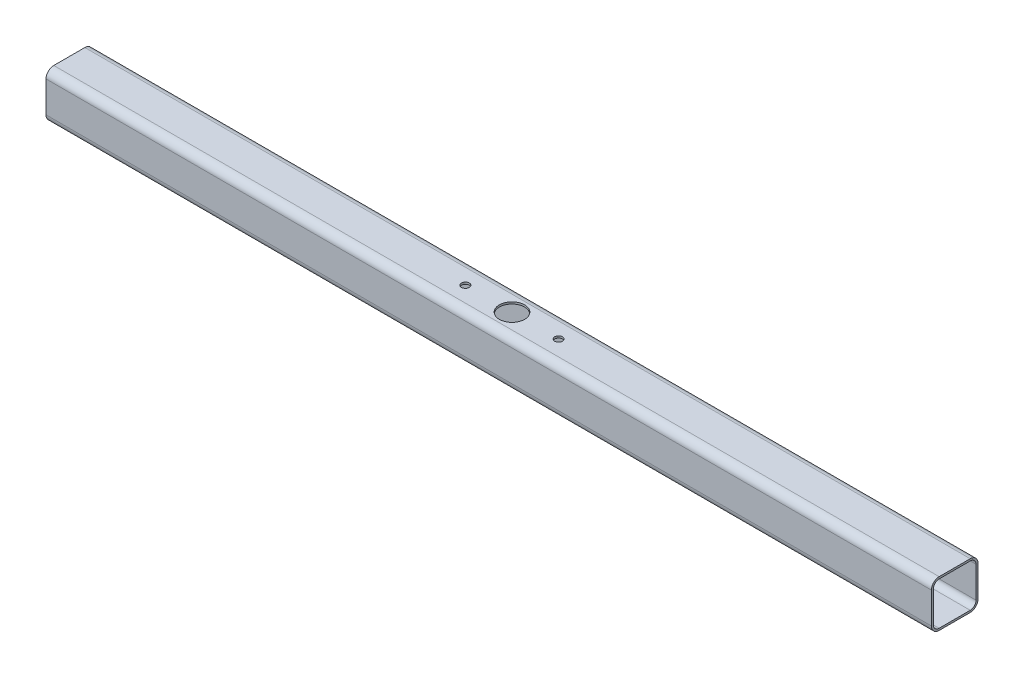
ISO-10303-21;
HEADER;
FILE_DESCRIPTION(('STEP AP214'),'2;1');
FILE_NAME('part.step','',(''),(''),'','','');
FILE_SCHEMA(('AUTOMOTIVE_DESIGN { 1 0 10303 214 1 1 1 1 }'));
ENDSEC;
DATA;
#1=APPLICATION_CONTEXT('core data for automotive mechanical design processes');
#2=APPLICATION_PROTOCOL_DEFINITION('international standard','automotive_design',2000,#1);
#3=PRODUCT_CONTEXT('',#1,'mechanical');
#4=PRODUCT('Part','Part','',(#3));
#5=PRODUCT_RELATED_PRODUCT_CATEGORY('part','',(#4));
#6=PRODUCT_DEFINITION_FORMATION('','',#4);
#7=PRODUCT_DEFINITION_CONTEXT('part definition',#1,'design');
#8=PRODUCT_DEFINITION('design','',#6,#7);
#9=PRODUCT_DEFINITION_SHAPE('','',#8);
#10=(LENGTH_UNIT() NAMED_UNIT(*) SI_UNIT(.MILLI.,.METRE.));
#11=(NAMED_UNIT(*) PLANE_ANGLE_UNIT() SI_UNIT($,.RADIAN.));
#12=(NAMED_UNIT(*) SI_UNIT($,.STERADIAN.) SOLID_ANGLE_UNIT());
#13=UNCERTAINTY_MEASURE_WITH_UNIT(LENGTH_MEASURE(1.E-05),#10,'distance_accuracy_value','');
#14=(GEOMETRIC_REPRESENTATION_CONTEXT(3) GLOBAL_UNCERTAINTY_ASSIGNED_CONTEXT((#13)) GLOBAL_UNIT_ASSIGNED_CONTEXT((#10,
#11,#12)) REPRESENTATION_CONTEXT('',''));
#15=CARTESIAN_POINT('',(0.,0.,0.));
#16=DIRECTION('',(0.,0.,1.));
#17=DIRECTION('',(1.,0.,0.));
#18=AXIS2_PLACEMENT_3D('',#15,#16,#17);
#19=CARTESIAN_POINT('',(-1447.8,-25.4000000000002,25.4));
#20=DIRECTION('',(1.,0.,0.));
#21=DIRECTION('',(0.,1.,0.));
#22=AXIS2_PLACEMENT_3D('',#19,#20,#21);
#23=CYLINDRICAL_SURFACE('',#22,12.7);
#24=CARTESIAN_POINT('',(0.,-25.4,25.4));
#25=DIRECTION('',(-1.,0.,0.));
#26=DIRECTION('',(0.,-1.,0.));
#27=AXIS2_PLACEMENT_3D('',#24,#25,#26);
#28=CIRCLE('',#27,12.7);
#29=CARTESIAN_POINT('',(0.,-38.1,25.4));
#30=VERTEX_POINT('',#29);
#31=CARTESIAN_POINT('',(0.,-25.4,38.1));
#32=VERTEX_POINT('',#31);
#33=EDGE_CURVE('E236',#30,#32,#28,.T.);
#34=ORIENTED_EDGE('',*,*,#33,.T.);
#35=DIRECTION('',(1.,0.,0.));
#36=VECTOR('',#35,1.);
#37=CARTESIAN_POINT('',(-1447.8,-25.4000000000002,38.1));
#38=LINE('',#37,#36);
#39=CARTESIAN_POINT('',(-1447.8,-25.4000000000002,38.1));
#40=VERTEX_POINT('',#39);
#41=EDGE_CURVE('E12',#40,#32,#38,.T.);
#42=ORIENTED_EDGE('',*,*,#41,.F.);
#43=CARTESIAN_POINT('',(-1447.8,-25.4000000000002,25.4));
#44=DIRECTION('',(-1.,0.,0.));
#45=DIRECTION('',(0.,-1.,0.));
#46=AXIS2_PLACEMENT_3D('',#43,#44,#45);
#47=CIRCLE('',#46,12.7);
#48=CARTESIAN_POINT('',(-1447.8,-38.1000000000002,25.4));
#49=VERTEX_POINT('',#48);
#50=EDGE_CURVE('E315',#49,#40,#47,.T.);
#51=ORIENTED_EDGE('',*,*,#50,.F.);
#52=DIRECTION('',(1.,0.,0.));
#53=VECTOR('',#52,1.);
#54=CARTESIAN_POINT('',(-1447.8,-38.1000000000002,25.4));
#55=LINE('',#54,#53);
#56=EDGE_CURVE('E251',#49,#30,#55,.T.);
#57=ORIENTED_EDGE('',*,*,#56,.T.);
#58=EDGE_LOOP('',(#34,#42,#51,#57));
#59=FACE_BOUND('',#58,.T.);
#60=ADVANCED_FACE('F62',(#59),#23,.T.);
#61=CARTESIAN_POINT('',(-1447.8,-25.4000000000002,38.1));
#62=DIRECTION('',(0.,0.,-1.));
#63=DIRECTION('',(-1.,0.,0.));
#64=AXIS2_PLACEMENT_3D('',#61,#62,#63);
#65=PLANE('',#64);
#66=DIRECTION('',(0.,1.,0.));
#67=VECTOR('',#66,1.);
#68=CARTESIAN_POINT('',(0.,-25.4,38.1));
#69=LINE('',#68,#67);
#70=CARTESIAN_POINT('',(0.,25.4,38.1));
#71=VERTEX_POINT('',#70);
#72=EDGE_CURVE('E239',#32,#71,#69,.T.);
#73=ORIENTED_EDGE('',*,*,#72,.T.);
#74=DIRECTION('',(1.,0.,0.));
#75=VECTOR('',#74,1.);
#76=CARTESIAN_POINT('',(-1447.8,25.3999999999998,38.1));
#77=LINE('',#76,#75);
#78=CARTESIAN_POINT('',(-1447.8,25.3999999999998,38.1));
#79=VERTEX_POINT('',#78);
#80=EDGE_CURVE('E72',#79,#71,#77,.T.);
#81=ORIENTED_EDGE('',*,*,#80,.F.);
#82=DIRECTION('',(0.,1.,0.));
#83=VECTOR('',#82,1.);
#84=CARTESIAN_POINT('',(-1447.8,-25.4000000000002,38.1));
#85=LINE('',#84,#83);
#86=EDGE_CURVE('E317',#40,#79,#85,.T.);
#87=ORIENTED_EDGE('',*,*,#86,.F.);
#88=ORIENTED_EDGE('',*,*,#41,.T.);
#89=EDGE_LOOP('',(#73,#81,#87,#88));
#90=FACE_BOUND('',#89,.T.);
#91=ADVANCED_FACE('F354',(#90),#65,.F.);
#92=CARTESIAN_POINT('',(-1447.8,25.3999999999998,25.4));
#93=DIRECTION('',(1.,0.,0.));
#94=DIRECTION('',(0.,1.,0.));
#95=AXIS2_PLACEMENT_3D('',#92,#93,#94);
#96=CYLINDRICAL_SURFACE('',#95,12.7);
#97=CARTESIAN_POINT('',(0.,25.4,25.4));
#98=DIRECTION('',(-1.,0.,0.));
#99=DIRECTION('',(0.,-1.,0.));
#100=AXIS2_PLACEMENT_3D('',#97,#98,#99);
#101=CIRCLE('',#100,12.7);
#102=CARTESIAN_POINT('',(0.,38.1,25.4));
#103=VERTEX_POINT('',#102);
#104=EDGE_CURVE('E241',#71,#103,#101,.T.);
#105=ORIENTED_EDGE('',*,*,#104,.T.);
#106=DIRECTION('',(1.,0.,0.));
#107=VECTOR('',#106,1.);
#108=CARTESIAN_POINT('',(-1447.8,38.0999999999998,25.4));
#109=LINE('',#108,#107);
#110=CARTESIAN_POINT('',(-1447.8,38.0999999999998,25.4));
#111=VERTEX_POINT('',#110);
#112=EDGE_CURVE('E258',#111,#103,#109,.T.);
#113=ORIENTED_EDGE('',*,*,#112,.F.);
#114=CARTESIAN_POINT('',(-1447.8,25.3999999999998,25.4));
#115=DIRECTION('',(-1.,0.,0.));
#116=DIRECTION('',(0.,-1.,0.));
#117=AXIS2_PLACEMENT_3D('',#114,#115,#116);
#118=CIRCLE('',#117,12.7);
#119=EDGE_CURVE('E319',#79,#111,#118,.T.);
#120=ORIENTED_EDGE('',*,*,#119,.F.);
#121=ORIENTED_EDGE('',*,*,#80,.T.);
#122=EDGE_LOOP('',(#105,#113,#120,#121));
#123=FACE_BOUND('',#122,.T.);
#124=ADVANCED_FACE('F359',(#123),#96,.T.);
#125=CARTESIAN_POINT('',(-1447.8,38.0999999999998,-25.4));
#126=DIRECTION('',(0.,-1.,0.));
#127=DIRECTION('',(1.,0.,0.));
#128=AXIS2_PLACEMENT_3D('',#125,#126,#127);
#129=PLANE('',#128);
#130=CARTESIAN_POINT('',(-800.1,38.0999999999999,0.));
#131=DIRECTION('',(0.,1.,0.));
#132=DIRECTION('',(0.,0.,1.));
#133=AXIS2_PLACEMENT_3D('',#130,#131,#132);
#134=CIRCLE('',#133,6.34999999999997);
#135=CARTESIAN_POINT('',(-800.1,38.0999999999999,6.34999999999997));
#136=VERTEX_POINT('',#135);
#137=EDGE_CURVE('E536',#136,#136,#134,.T.);
#138=ORIENTED_EDGE('',*,*,#137,.F.);
#139=EDGE_LOOP('',(#138));
#140=FACE_BOUND('',#139,.T.);
#141=CARTESIAN_POINT('',(-647.7,38.0999999999999,0.));
#142=DIRECTION('',(0.,1.,0.));
#143=DIRECTION('',(0.,0.,1.));
#144=AXIS2_PLACEMENT_3D('',#141,#142,#143);
#145=CIRCLE('',#144,6.34999999999997);
#146=CARTESIAN_POINT('',(-647.7,38.0999999999999,6.34999999999997));
#147=VERTEX_POINT('',#146);
#148=EDGE_CURVE('E538',#147,#147,#145,.T.);
#149=ORIENTED_EDGE('',*,*,#148,.F.);
#150=EDGE_LOOP('',(#149));
#151=FACE_BOUND('',#150,.T.);
#152=CARTESIAN_POINT('',(-723.9,38.0999999999999,0.));
#153=DIRECTION('',(0.,1.,0.));
#154=DIRECTION('',(-1.,0.,0.));
#155=AXIS2_PLACEMENT_3D('',#152,#153,#154);
#156=CIRCLE('',#155,20.6375);
#157=CARTESIAN_POINT('',(-744.5375,38.0999999999999,0.));
#158=VERTEX_POINT('',#157);
#159=EDGE_CURVE('E545',#158,#158,#156,.T.);
#160=ORIENTED_EDGE('',*,*,#159,.F.);
#161=EDGE_LOOP('',(#160));
#162=FACE_BOUND('',#161,.T.);
#163=DIRECTION('',(0.,0.,-1.));
#164=VECTOR('',#163,1.);
#165=CARTESIAN_POINT('',(0.,38.1,-25.4));
#166=LINE('',#165,#164);
#167=CARTESIAN_POINT('',(0.,38.1,-25.4));
#168=VERTEX_POINT('',#167);
#169=EDGE_CURVE('E243',#103,#168,#166,.T.);
#170=ORIENTED_EDGE('',*,*,#169,.T.);
#171=DIRECTION('',(1.,0.,0.));
#172=VECTOR('',#171,1.);
#173=CARTESIAN_POINT('',(-1447.8,38.0999999999998,-25.4));
#174=LINE('',#173,#172);
#175=CARTESIAN_POINT('',(-1447.8,38.0999999999998,-25.4));
#176=VERTEX_POINT('',#175);
#177=EDGE_CURVE('E255',#176,#168,#174,.T.);
#178=ORIENTED_EDGE('',*,*,#177,.F.);
#179=DIRECTION('',(0.,0.,-1.));
#180=VECTOR('',#179,1.);
#181=CARTESIAN_POINT('',(-1447.8,38.0999999999998,-25.4));
#182=LINE('',#181,#180);
#183=EDGE_CURVE('E321',#111,#176,#182,.T.);
#184=ORIENTED_EDGE('',*,*,#183,.F.);
#185=ORIENTED_EDGE('',*,*,#112,.T.);
#186=EDGE_LOOP('',(#170,#178,#184,#185));
#187=FACE_BOUND('',#186,.T.);
#188=ADVANCED_FACE('F327',(#140,#151,#162,#187),#129,.F.);
#189=CARTESIAN_POINT('',(-1447.8,25.3999999999998,-25.4));
#190=DIRECTION('',(1.,0.,0.));
#191=DIRECTION('',(0.,1.,0.));
#192=AXIS2_PLACEMENT_3D('',#189,#190,#191);
#193=CYLINDRICAL_SURFACE('',#192,12.7);
#194=CARTESIAN_POINT('',(0.,25.4,-25.4));
#195=DIRECTION('',(-1.,0.,0.));
#196=DIRECTION('',(0.,-1.,0.));
#197=AXIS2_PLACEMENT_3D('',#194,#195,#196);
#198=CIRCLE('',#197,12.7);
#199=CARTESIAN_POINT('',(0.,25.4,-38.1));
#200=VERTEX_POINT('',#199);
#201=EDGE_CURVE('E245',#168,#200,#198,.T.);
#202=ORIENTED_EDGE('',*,*,#201,.T.);
#203=DIRECTION('',(1.,0.,0.));
#204=VECTOR('',#203,1.);
#205=CARTESIAN_POINT('',(-1447.8,25.3999999999998,-38.1));
#206=LINE('',#205,#204);
#207=CARTESIAN_POINT('',(-1447.8,25.3999999999998,-38.1));
#208=VERTEX_POINT('',#207);
#209=EDGE_CURVE('E202',#208,#200,#206,.T.);
#210=ORIENTED_EDGE('',*,*,#209,.F.);
#211=CARTESIAN_POINT('',(-1447.8,25.3999999999998,-25.4));
#212=DIRECTION('',(-1.,0.,0.));
#213=DIRECTION('',(0.,-1.,0.));
#214=AXIS2_PLACEMENT_3D('',#211,#212,#213);
#215=CIRCLE('',#214,12.7);
#216=EDGE_CURVE('E193',#176,#208,#215,.T.);
#217=ORIENTED_EDGE('',*,*,#216,.F.);
#218=ORIENTED_EDGE('',*,*,#177,.T.);
#219=EDGE_LOOP('',(#202,#210,#217,#218));
#220=FACE_BOUND('',#219,.T.);
#221=ADVANCED_FACE('F331',(#220),#193,.T.);
#222=CARTESIAN_POINT('',(-1447.8,25.3999999999998,-38.1));
#223=DIRECTION('',(0.,0.,1.));
#224=DIRECTION('',(1.,0.,0.));
#225=AXIS2_PLACEMENT_3D('',#222,#223,#224);
#226=PLANE('',#225);
#227=DIRECTION('',(0.,-1.,0.));
#228=VECTOR('',#227,1.);
#229=CARTESIAN_POINT('',(0.,25.4,-38.1));
#230=LINE('',#229,#228);
#231=CARTESIAN_POINT('',(0.,-25.4,-38.1));
#232=VERTEX_POINT('',#231);
#233=EDGE_CURVE('E201',#200,#232,#230,.T.);
#234=ORIENTED_EDGE('',*,*,#233,.T.);
#235=DIRECTION('',(1.,0.,0.));
#236=VECTOR('',#235,1.);
#237=CARTESIAN_POINT('',(-1447.8,-25.4000000000002,-38.1));
#238=LINE('',#237,#236);
#239=CARTESIAN_POINT('',(-1447.8,-25.4000000000002,-38.1));
#240=VERTEX_POINT('',#239);
#241=EDGE_CURVE('E198',#240,#232,#238,.T.);
#242=ORIENTED_EDGE('',*,*,#241,.F.);
#243=DIRECTION('',(0.,-1.,0.));
#244=VECTOR('',#243,1.);
#245=CARTESIAN_POINT('',(-1447.8,25.3999999999998,-38.1));
#246=LINE('',#245,#244);
#247=EDGE_CURVE('E187',#208,#240,#246,.T.);
#248=ORIENTED_EDGE('',*,*,#247,.F.);
#249=ORIENTED_EDGE('',*,*,#209,.T.);
#250=EDGE_LOOP('',(#234,#242,#248,#249));
#251=FACE_BOUND('',#250,.T.);
#252=ADVANCED_FACE('F199',(#251),#226,.F.);
#253=CARTESIAN_POINT('',(-1447.8,-25.4000000000002,-25.4));
#254=DIRECTION('',(1.,0.,0.));
#255=DIRECTION('',(0.,1.,0.));
#256=AXIS2_PLACEMENT_3D('',#253,#254,#255);
#257=CYLINDRICAL_SURFACE('',#256,12.7);
#258=CARTESIAN_POINT('',(0.,-25.4,-25.4));
#259=DIRECTION('',(-1.,0.,0.));
#260=DIRECTION('',(0.,-1.,0.));
#261=AXIS2_PLACEMENT_3D('',#258,#259,#260);
#262=CIRCLE('',#261,12.7);
#263=CARTESIAN_POINT('',(0.,-38.1,-25.4));
#264=VERTEX_POINT('',#263);
#265=EDGE_CURVE('E134',#232,#264,#262,.T.);
#266=ORIENTED_EDGE('',*,*,#265,.T.);
#267=DIRECTION('',(1.,0.,0.));
#268=VECTOR('',#267,1.);
#269=CARTESIAN_POINT('',(-1447.8,-38.1000000000002,-25.4));
#270=LINE('',#269,#268);
#271=CARTESIAN_POINT('',(-1447.8,-38.1000000000002,-25.4));
#272=VERTEX_POINT('',#271);
#273=EDGE_CURVE('E203',#272,#264,#270,.T.);
#274=ORIENTED_EDGE('',*,*,#273,.F.);
#275=CARTESIAN_POINT('',(-1447.8,-25.4000000000002,-25.4));
#276=DIRECTION('',(-1.,0.,0.));
#277=DIRECTION('',(0.,-1.,0.));
#278=AXIS2_PLACEMENT_3D('',#275,#276,#277);
#279=CIRCLE('',#278,12.7);
#280=EDGE_CURVE('E191',#240,#272,#279,.T.);
#281=ORIENTED_EDGE('',*,*,#280,.F.);
#282=ORIENTED_EDGE('',*,*,#241,.T.);
#283=EDGE_LOOP('',(#266,#274,#281,#282));
#284=FACE_BOUND('',#283,.T.);
#285=ADVANCED_FACE('F205',(#284),#257,.T.);
#286=CARTESIAN_POINT('',(-1447.8,25.3999999999998,25.4));
#287=DIRECTION('',(1.,0.,0.));
#288=DIRECTION('',(0.,1.,0.));
#289=AXIS2_PLACEMENT_3D('',#286,#287,#288);
#290=CYLINDRICAL_SURFACE('',#289,9.52499999999999);
#291=CARTESIAN_POINT('',(0.,25.4,25.4));
#292=DIRECTION('',(-1.,0.,0.));
#293=DIRECTION('',(0.,-1.,0.));
#294=AXIS2_PLACEMENT_3D('',#291,#292,#293);
#295=CIRCLE('',#294,9.52499999999999);
#296=CARTESIAN_POINT('',(0.,25.4,34.925));
#297=VERTEX_POINT('',#296);
#298=CARTESIAN_POINT('',(0.,34.925,25.4));
#299=VERTEX_POINT('',#298);
#300=EDGE_CURVE('E211',#297,#299,#295,.T.);
#301=ORIENTED_EDGE('',*,*,#300,.F.);
#302=DIRECTION('',(1.,0.,0.));
#303=VECTOR('',#302,1.);
#304=CARTESIAN_POINT('',(-1447.8,25.3999999999998,34.925));
#305=LINE('',#304,#303);
#306=CARTESIAN_POINT('',(-1447.8,25.3999999999998,34.925));
#307=VERTEX_POINT('',#306);
#308=EDGE_CURVE('E148',#307,#297,#305,.T.);
#309=ORIENTED_EDGE('',*,*,#308,.F.);
#310=CARTESIAN_POINT('',(-1447.8,25.3999999999998,25.4));
#311=DIRECTION('',(-1.,0.,0.));
#312=DIRECTION('',(0.,-1.,0.));
#313=AXIS2_PLACEMENT_3D('',#310,#311,#312);
#314=CIRCLE('',#313,9.52499999999999);
#315=CARTESIAN_POINT('',(-1447.8,34.9249999999998,25.4));
#316=VERTEX_POINT('',#315);
#317=EDGE_CURVE('E250',#307,#316,#314,.T.);
#318=ORIENTED_EDGE('',*,*,#317,.T.);
#319=DIRECTION('',(1.,0.,0.));
#320=VECTOR('',#319,1.);
#321=CARTESIAN_POINT('',(-1447.8,34.9249999999998,25.4));
#322=LINE('',#321,#320);
#323=EDGE_CURVE('E207',#316,#299,#322,.T.);
#324=ORIENTED_EDGE('',*,*,#323,.T.);
#325=EDGE_LOOP('',(#301,#309,#318,#324));
#326=FACE_BOUND('',#325,.T.);
#327=ADVANCED_FACE('F64',(#326),#290,.F.);
#328=CARTESIAN_POINT('',(-1447.8,-25.4000000000002,34.925));
#329=DIRECTION('',(0.,0.,-1.));
#330=DIRECTION('',(-1.,0.,0.));
#331=AXIS2_PLACEMENT_3D('',#328,#329,#330);
#332=PLANE('',#331);
#333=DIRECTION('',(0.,1.,0.));
#334=VECTOR('',#333,1.);
#335=CARTESIAN_POINT('',(0.,-25.4,34.925));
#336=LINE('',#335,#334);
#337=CARTESIAN_POINT('',(0.,-25.4,34.925));
#338=VERTEX_POINT('',#337);
#339=EDGE_CURVE('E214',#338,#297,#336,.T.);
#340=ORIENTED_EDGE('',*,*,#339,.F.);
#341=DIRECTION('',(1.,0.,0.));
#342=VECTOR('',#341,1.);
#343=CARTESIAN_POINT('',(-1447.8,-25.4000000000002,34.925));
#344=LINE('',#343,#342);
#345=CARTESIAN_POINT('',(-1447.8,-25.4000000000002,34.925));
#346=VERTEX_POINT('',#345);
#347=EDGE_CURVE('E274',#346,#338,#344,.T.);
#348=ORIENTED_EDGE('',*,*,#347,.F.);
#349=DIRECTION('',(0.,1.,0.));
#350=VECTOR('',#349,1.);
#351=CARTESIAN_POINT('',(-1447.8,-25.4000000000002,34.925));
#352=LINE('',#351,#350);
#353=EDGE_CURVE('E280',#346,#307,#352,.T.);
#354=ORIENTED_EDGE('',*,*,#353,.T.);
#355=ORIENTED_EDGE('',*,*,#308,.T.);
#356=EDGE_LOOP('',(#340,#348,#354,#355));
#357=FACE_BOUND('',#356,.T.);
#358=ADVANCED_FACE('F278',(#357),#332,.T.);
#359=CARTESIAN_POINT('',(-1447.8,-25.4000000000002,25.4));
#360=DIRECTION('',(1.,0.,0.));
#361=DIRECTION('',(0.,1.,0.));
#362=AXIS2_PLACEMENT_3D('',#359,#360,#361);
#363=CYLINDRICAL_SURFACE('',#362,9.52499999999999);
#364=CARTESIAN_POINT('',(0.,-25.4,25.4));
#365=DIRECTION('',(-1.,0.,0.));
#366=DIRECTION('',(0.,-1.,0.));
#367=AXIS2_PLACEMENT_3D('',#364,#365,#366);
#368=CIRCLE('',#367,9.52499999999999);
#369=CARTESIAN_POINT('',(0.,-34.925,25.4));
#370=VERTEX_POINT('',#369);
#371=EDGE_CURVE('E218',#370,#338,#368,.T.);
#372=ORIENTED_EDGE('',*,*,#371,.F.);
#373=DIRECTION('',(1.,0.,0.));
#374=VECTOR('',#373,1.);
#375=CARTESIAN_POINT('',(-1447.8,-34.9250000000002,25.4));
#376=LINE('',#375,#374);
#377=CARTESIAN_POINT('',(-1447.8,-34.9250000000002,25.4));
#378=VERTEX_POINT('',#377);
#379=EDGE_CURVE('E272',#378,#370,#376,.T.);
#380=ORIENTED_EDGE('',*,*,#379,.F.);
#381=CARTESIAN_POINT('',(-1447.8,-25.4000000000002,25.4));
#382=DIRECTION('',(-1.,0.,0.));
#383=DIRECTION('',(0.,-1.,0.));
#384=AXIS2_PLACEMENT_3D('',#381,#382,#383);
#385=CIRCLE('',#384,9.52499999999999);
#386=EDGE_CURVE('E291',#378,#346,#385,.T.);
#387=ORIENTED_EDGE('',*,*,#386,.T.);
#388=ORIENTED_EDGE('',*,*,#347,.T.);
#389=EDGE_LOOP('',(#372,#380,#387,#388));
#390=FACE_BOUND('',#389,.T.);
#391=ADVANCED_FACE('F288',(#390),#363,.F.);
#392=CARTESIAN_POINT('',(-1447.8,-34.9250000000002,25.4));
#393=DIRECTION('',(0.,1.,0.));
#394=DIRECTION('',(-1.,0.,0.));
#395=AXIS2_PLACEMENT_3D('',#392,#393,#394);
#396=PLANE('',#395);
#397=CARTESIAN_POINT('',(-723.9,-34.9250000000001,0.));
#398=DIRECTION('',(0.,1.,0.));
#399=DIRECTION('',(-1.,0.,0.));
#400=AXIS2_PLACEMENT_3D('',#397,#398,#399);
#401=CIRCLE('',#400,20.6375);
#402=CARTESIAN_POINT('',(-744.5375,-34.9250000000001,0.));
#403=VERTEX_POINT('',#402);
#404=EDGE_CURVE('E215',#403,#403,#401,.T.);
#405=ORIENTED_EDGE('',*,*,#404,.F.);
#406=EDGE_LOOP('',(#405));
#407=FACE_BOUND('',#406,.T.);
#408=DIRECTION('',(0.,0.,1.));
#409=VECTOR('',#408,1.);
#410=CARTESIAN_POINT('',(0.,-34.925,25.4));
#411=LINE('',#410,#409);
#412=CARTESIAN_POINT('',(0.,-34.925,-25.4));
#413=VERTEX_POINT('',#412);
#414=EDGE_CURVE('E221',#413,#370,#411,.T.);
#415=ORIENTED_EDGE('',*,*,#414,.F.);
#416=DIRECTION('',(1.,0.,0.));
#417=VECTOR('',#416,1.);
#418=CARTESIAN_POINT('',(-1447.8,-34.9250000000002,-25.4));
#419=LINE('',#418,#417);
#420=CARTESIAN_POINT('',(-1447.8,-34.9250000000002,-25.4));
#421=VERTEX_POINT('',#420);
#422=EDGE_CURVE('E270',#421,#413,#419,.T.);
#423=ORIENTED_EDGE('',*,*,#422,.F.);
#424=DIRECTION('',(0.,0.,1.));
#425=VECTOR('',#424,1.);
#426=CARTESIAN_POINT('',(-1447.8,-34.9250000000002,25.4));
#427=LINE('',#426,#425);
#428=EDGE_CURVE('E297',#421,#378,#427,.T.);
#429=ORIENTED_EDGE('',*,*,#428,.T.);
#430=ORIENTED_EDGE('',*,*,#379,.T.);
#431=EDGE_LOOP('',(#415,#423,#429,#430));
#432=FACE_BOUND('',#431,.T.);
#433=ADVANCED_FACE('F374',(#407,#432),#396,.T.);
#434=CARTESIAN_POINT('',(-1447.8,-25.4000000000002,-25.4));
#435=DIRECTION('',(1.,0.,0.));
#436=DIRECTION('',(0.,1.,0.));
#437=AXIS2_PLACEMENT_3D('',#434,#435,#436);
#438=CYLINDRICAL_SURFACE('',#437,9.52499999999999);
#439=CARTESIAN_POINT('',(0.,-25.4,-25.4));
#440=DIRECTION('',(-1.,0.,0.));
#441=DIRECTION('',(0.,-1.,0.));
#442=AXIS2_PLACEMENT_3D('',#439,#440,#441);
#443=CIRCLE('',#442,9.52499999999999);
#444=CARTESIAN_POINT('',(0.,-25.4,-34.925));
#445=VERTEX_POINT('',#444);
#446=EDGE_CURVE('E224',#445,#413,#443,.T.);
#447=ORIENTED_EDGE('',*,*,#446,.F.);
#448=DIRECTION('',(1.,0.,0.));
#449=VECTOR('',#448,1.);
#450=CARTESIAN_POINT('',(-1447.8,-25.4000000000002,-34.925));
#451=LINE('',#450,#449);
#452=CARTESIAN_POINT('',(-1447.8,-25.4000000000002,-34.925));
#453=VERTEX_POINT('',#452);
#454=EDGE_CURVE('E268',#453,#445,#451,.T.);
#455=ORIENTED_EDGE('',*,*,#454,.F.);
#456=CARTESIAN_POINT('',(-1447.8,-25.4000000000002,-25.4));
#457=DIRECTION('',(-1.,0.,0.));
#458=DIRECTION('',(0.,-1.,0.));
#459=AXIS2_PLACEMENT_3D('',#456,#457,#458);
#460=CIRCLE('',#459,9.52499999999999);
#461=EDGE_CURVE('E303',#453,#421,#460,.T.);
#462=ORIENTED_EDGE('',*,*,#461,.T.);
#463=ORIENTED_EDGE('',*,*,#422,.T.);
#464=EDGE_LOOP('',(#447,#455,#462,#463));
#465=FACE_BOUND('',#464,.T.);
#466=ADVANCED_FACE('F370',(#465),#438,.F.);
#467=CARTESIAN_POINT('',(-1447.8,25.3999999999998,-34.925));
#468=DIRECTION('',(0.,0.,1.));
#469=DIRECTION('',(1.,0.,0.));
#470=AXIS2_PLACEMENT_3D('',#467,#468,#469);
#471=PLANE('',#470);
#472=DIRECTION('',(0.,-1.,0.));
#473=VECTOR('',#472,1.);
#474=CARTESIAN_POINT('',(0.,25.4,-34.925));
#475=LINE('',#474,#473);
#476=CARTESIAN_POINT('',(0.,25.4,-34.925));
#477=VERTEX_POINT('',#476);
#478=EDGE_CURVE('E227',#477,#445,#475,.T.);
#479=ORIENTED_EDGE('',*,*,#478,.F.);
#480=DIRECTION('',(1.,0.,0.));
#481=VECTOR('',#480,1.);
#482=CARTESIAN_POINT('',(-1447.8,25.3999999999998,-34.925));
#483=LINE('',#482,#481);
#484=CARTESIAN_POINT('',(-1447.8,25.3999999999998,-34.925));
#485=VERTEX_POINT('',#484);
#486=EDGE_CURVE('E266',#485,#477,#483,.T.);
#487=ORIENTED_EDGE('',*,*,#486,.F.);
#488=DIRECTION('',(0.,-1.,0.));
#489=VECTOR('',#488,1.);
#490=CARTESIAN_POINT('',(-1447.8,25.3999999999998,-34.925));
#491=LINE('',#490,#489);
#492=EDGE_CURVE('E306',#485,#453,#491,.T.);
#493=ORIENTED_EDGE('',*,*,#492,.T.);
#494=ORIENTED_EDGE('',*,*,#454,.T.);
#495=EDGE_LOOP('',(#479,#487,#493,#494));
#496=FACE_BOUND('',#495,.T.);
#497=ADVANCED_FACE('F366',(#496),#471,.T.);
#498=CARTESIAN_POINT('',(-1447.8,25.3999999999998,-25.4));
#499=DIRECTION('',(1.,0.,0.));
#500=DIRECTION('',(0.,1.,0.));
#501=AXIS2_PLACEMENT_3D('',#498,#499,#500);
#502=CYLINDRICAL_SURFACE('',#501,9.525);
#503=CARTESIAN_POINT('',(0.,25.4,-25.4));
#504=DIRECTION('',(-1.,0.,0.));
#505=DIRECTION('',(0.,-1.,0.));
#506=AXIS2_PLACEMENT_3D('',#503,#504,#505);
#507=CIRCLE('',#506,9.525);
#508=CARTESIAN_POINT('',(0.,34.925,-25.4));
#509=VERTEX_POINT('',#508);
#510=EDGE_CURVE('E230',#509,#477,#507,.T.);
#511=ORIENTED_EDGE('',*,*,#510,.F.);
#512=DIRECTION('',(1.,0.,0.));
#513=VECTOR('',#512,1.);
#514=CARTESIAN_POINT('',(-1447.8,34.9249999999998,-25.4));
#515=LINE('',#514,#513);
#516=CARTESIAN_POINT('',(-1447.8,34.9249999999998,-25.4));
#517=VERTEX_POINT('',#516);
#518=EDGE_CURVE('E264',#517,#509,#515,.T.);
#519=ORIENTED_EDGE('',*,*,#518,.F.);
#520=CARTESIAN_POINT('',(-1447.8,25.3999999999998,-25.4));
#521=DIRECTION('',(-1.,0.,0.));
#522=DIRECTION('',(0.,-1.,0.));
#523=AXIS2_PLACEMENT_3D('',#520,#521,#522);
#524=CIRCLE('',#523,9.525);
#525=EDGE_CURVE('E309',#517,#485,#524,.T.);
#526=ORIENTED_EDGE('',*,*,#525,.T.);
#527=ORIENTED_EDGE('',*,*,#486,.T.);
#528=EDGE_LOOP('',(#511,#519,#526,#527));
#529=FACE_BOUND('',#528,.T.);
#530=ADVANCED_FACE('F347',(#529),#502,.F.);
#531=CARTESIAN_POINT('',(-1447.8,34.9249999999998,-25.4));
#532=DIRECTION('',(0.,-1.,0.));
#533=DIRECTION('',(1.,0.,0.));
#534=AXIS2_PLACEMENT_3D('',#531,#532,#533);
#535=PLANE('',#534);
#536=CARTESIAN_POINT('',(-800.1,34.9249999999999,0.));
#537=DIRECTION('',(0.,-1.,0.));
#538=DIRECTION('',(1.,0.,0.));
#539=AXIS2_PLACEMENT_3D('',#536,#537,#538);
#540=CIRCLE('',#539,6.34999999999997);
#541=CARTESIAN_POINT('',(-793.75,34.9249999999999,0.));
#542=VERTEX_POINT('',#541);
#543=EDGE_CURVE('E66',#542,#542,#540,.T.);
#544=ORIENTED_EDGE('',*,*,#543,.F.);
#545=EDGE_LOOP('',(#544));
#546=FACE_BOUND('',#545,.T.);
#547=CARTESIAN_POINT('',(-647.7,34.9249999999999,0.));
#548=DIRECTION('',(0.,-1.,0.));
#549=DIRECTION('',(1.,0.,0.));
#550=AXIS2_PLACEMENT_3D('',#547,#548,#549);
#551=CIRCLE('',#550,6.34999999999997);
#552=CARTESIAN_POINT('',(-641.35,34.9249999999999,0.));
#553=VERTEX_POINT('',#552);
#554=EDGE_CURVE('E542',#553,#553,#551,.T.);
#555=ORIENTED_EDGE('',*,*,#554,.F.);
#556=EDGE_LOOP('',(#555));
#557=FACE_BOUND('',#556,.T.);
#558=CARTESIAN_POINT('',(-723.9,34.9249999999999,0.));
#559=DIRECTION('',(0.,-1.,0.));
#560=DIRECTION('',(1.,0.,0.));
#561=AXIS2_PLACEMENT_3D('',#558,#559,#560);
#562=CIRCLE('',#561,20.6375);
#563=CARTESIAN_POINT('',(-703.2625,34.9249999999999,0.));
#564=VERTEX_POINT('',#563);
#565=EDGE_CURVE('E548',#564,#564,#562,.T.);
#566=ORIENTED_EDGE('',*,*,#565,.F.);
#567=EDGE_LOOP('',(#566));
#568=FACE_BOUND('',#567,.T.);
#569=DIRECTION('',(0.,0.,-1.));
#570=VECTOR('',#569,1.);
#571=CARTESIAN_POINT('',(0.,34.925,-25.4));
#572=LINE('',#571,#570);
#573=EDGE_CURVE('E233',#299,#509,#572,.T.);
#574=ORIENTED_EDGE('',*,*,#573,.F.);
#575=ORIENTED_EDGE('',*,*,#323,.F.);
#576=DIRECTION('',(0.,0.,-1.));
#577=VECTOR('',#576,1.);
#578=CARTESIAN_POINT('',(-1447.8,34.9249999999998,-25.4));
#579=LINE('',#578,#577);
#580=EDGE_CURVE('E312',#316,#517,#579,.T.);
#581=ORIENTED_EDGE('',*,*,#580,.T.);
#582=ORIENTED_EDGE('',*,*,#518,.T.);
#583=EDGE_LOOP('',(#574,#575,#581,#582));
#584=FACE_BOUND('',#583,.T.);
#585=ADVANCED_FACE('F339',(#546,#557,#568,#584),#535,.T.);
#586=CARTESIAN_POINT('',(-1447.8,-38.1000000000002,25.4));
#587=DIRECTION('',(0.,1.,0.));
#588=DIRECTION('',(-1.,0.,0.));
#589=AXIS2_PLACEMENT_3D('',#586,#587,#588);
#590=PLANE('',#589);
#591=CARTESIAN_POINT('',(-723.9,-38.1000000000003,0.));
#592=DIRECTION('',(0.,1.,0.));
#593=DIRECTION('',(-1.,0.,0.));
#594=AXIS2_PLACEMENT_3D('',#591,#592,#593);
#595=CIRCLE('',#594,20.6375);
#596=CARTESIAN_POINT('',(-744.5375,-38.1000000000003,0.));
#597=VERTEX_POINT('',#596);
#598=EDGE_CURVE('E546',#597,#597,#595,.T.);
#599=ORIENTED_EDGE('',*,*,#598,.T.);
#600=EDGE_LOOP('',(#599));
#601=FACE_BOUND('',#600,.T.);
#602=DIRECTION('',(0.,0.,1.));
#603=VECTOR('',#602,1.);
#604=CARTESIAN_POINT('',(0.,-38.1,25.4));
#605=LINE('',#604,#603);
#606=EDGE_CURVE('E140',#264,#30,#605,.T.);
#607=ORIENTED_EDGE('',*,*,#606,.T.);
#608=ORIENTED_EDGE('',*,*,#56,.F.);
#609=DIRECTION('',(0.,0.,1.));
#610=VECTOR('',#609,1.);
#611=CARTESIAN_POINT('',(-1447.8,-38.1000000000002,25.4));
#612=LINE('',#611,#610);
#613=EDGE_CURVE('E81',#272,#49,#612,.T.);
#614=ORIENTED_EDGE('',*,*,#613,.F.);
#615=ORIENTED_EDGE('',*,*,#273,.T.);
#616=EDGE_LOOP('',(#607,#608,#614,#615));
#617=FACE_BOUND('',#616,.T.);
#618=ADVANCED_FACE('F337',(#601,#617),#590,.F.);
#619=CARTESIAN_POINT('',(-1447.8,-25.4000000000002,25.4));
#620=DIRECTION('',(-1.,0.,0.));
#621=DIRECTION('',(0.,-1.,0.));
#622=AXIS2_PLACEMENT_3D('',#619,#620,#621);
#623=PLANE('',#622);
#624=ORIENTED_EDGE('',*,*,#317,.F.);
#625=ORIENTED_EDGE('',*,*,#353,.F.);
#626=ORIENTED_EDGE('',*,*,#386,.F.);
#627=ORIENTED_EDGE('',*,*,#428,.F.);
#628=ORIENTED_EDGE('',*,*,#461,.F.);
#629=ORIENTED_EDGE('',*,*,#492,.F.);
#630=ORIENTED_EDGE('',*,*,#525,.F.);
#631=ORIENTED_EDGE('',*,*,#580,.F.);
#632=EDGE_LOOP('',(#624,#625,#626,#627,#628,#629,#630,#631));
#633=FACE_BOUND('',#632,.T.);
#634=ORIENTED_EDGE('',*,*,#50,.T.);
#635=ORIENTED_EDGE('',*,*,#86,.T.);
#636=ORIENTED_EDGE('',*,*,#119,.T.);
#637=ORIENTED_EDGE('',*,*,#183,.T.);
#638=ORIENTED_EDGE('',*,*,#216,.T.);
#639=ORIENTED_EDGE('',*,*,#247,.T.);
#640=ORIENTED_EDGE('',*,*,#280,.T.);
#641=ORIENTED_EDGE('',*,*,#613,.T.);
#642=EDGE_LOOP('',(#634,#635,#636,#637,#638,#639,#640,#641));
#643=FACE_BOUND('',#642,.T.);
#644=ADVANCED_FACE('F189',(#633,#643),#623,.T.);
#645=CARTESIAN_POINT('',(0.,-25.4,25.4));
#646=DIRECTION('',(-1.,0.,0.));
#647=DIRECTION('',(0.,-1.,0.));
#648=AXIS2_PLACEMENT_3D('',#645,#646,#647);
#649=PLANE('',#648);
#650=ORIENTED_EDGE('',*,*,#300,.T.);
#651=ORIENTED_EDGE('',*,*,#573,.T.);
#652=ORIENTED_EDGE('',*,*,#510,.T.);
#653=ORIENTED_EDGE('',*,*,#478,.T.);
#654=ORIENTED_EDGE('',*,*,#446,.T.);
#655=ORIENTED_EDGE('',*,*,#414,.T.);
#656=ORIENTED_EDGE('',*,*,#371,.T.);
#657=ORIENTED_EDGE('',*,*,#339,.T.);
#658=EDGE_LOOP('',(#650,#651,#652,#653,#654,#655,#656,#657));
#659=FACE_BOUND('',#658,.T.);
#660=ORIENTED_EDGE('',*,*,#33,.F.);
#661=ORIENTED_EDGE('',*,*,#606,.F.);
#662=ORIENTED_EDGE('',*,*,#265,.F.);
#663=ORIENTED_EDGE('',*,*,#233,.F.);
#664=ORIENTED_EDGE('',*,*,#201,.F.);
#665=ORIENTED_EDGE('',*,*,#169,.F.);
#666=ORIENTED_EDGE('',*,*,#104,.F.);
#667=ORIENTED_EDGE('',*,*,#72,.F.);
#668=EDGE_LOOP('',(#660,#661,#662,#663,#664,#665,#666,#667));
#669=FACE_BOUND('',#668,.T.);
#670=ADVANCED_FACE('F283',(#659,#669),#649,.F.);
#671=CARTESIAN_POINT('',(-723.9,-38.1000000000003,0.));
#672=DIRECTION('',(0.,1.,0.));
#673=DIRECTION('',(-1.,0.,0.));
#674=AXIS2_PLACEMENT_3D('',#671,#672,#673);
#675=CYLINDRICAL_SURFACE('',#674,20.6375);
#676=ORIENTED_EDGE('',*,*,#404,.T.);
#677=EDGE_LOOP('',(#676));
#678=FACE_BOUND('',#677,.T.);
#679=ORIENTED_EDGE('',*,*,#598,.F.);
#680=EDGE_LOOP('',(#679));
#681=FACE_BOUND('',#680,.T.);
#682=ADVANCED_FACE('F480',(#678,#681),#675,.F.);
#683=ORIENTED_EDGE('',*,*,#565,.T.);
#684=EDGE_LOOP('',(#683));
#685=FACE_BOUND('',#684,.T.);
#686=ORIENTED_EDGE('',*,*,#159,.T.);
#687=EDGE_LOOP('',(#686));
#688=FACE_BOUND('',#687,.T.);
#689=ADVANCED_FACE('F498',(#685,#688),#675,.F.);
#690=CARTESIAN_POINT('',(-647.7,38.0999999999999,0.));
#691=DIRECTION('',(0.,1.,0.));
#692=DIRECTION('',(0.,0.,1.));
#693=AXIS2_PLACEMENT_3D('',#690,#691,#692);
#694=CYLINDRICAL_SURFACE('',#693,6.34999999999997);
#695=ORIENTED_EDGE('',*,*,#554,.T.);
#696=EDGE_LOOP('',(#695));
#697=FACE_BOUND('',#696,.T.);
#698=ORIENTED_EDGE('',*,*,#148,.T.);
#699=EDGE_LOOP('',(#698));
#700=FACE_BOUND('',#699,.T.);
#701=ADVANCED_FACE('F507',(#697,#700),#694,.F.);
#702=CARTESIAN_POINT('',(-800.1,38.0999999999999,0.));
#703=DIRECTION('',(0.,1.,0.));
#704=DIRECTION('',(0.,0.,1.));
#705=AXIS2_PLACEMENT_3D('',#702,#703,#704);
#706=CYLINDRICAL_SURFACE('',#705,6.34999999999997);
#707=ORIENTED_EDGE('',*,*,#543,.T.);
#708=EDGE_LOOP('',(#707));
#709=FACE_BOUND('',#708,.T.);
#710=ORIENTED_EDGE('',*,*,#137,.T.);
#711=EDGE_LOOP('',(#710));
#712=FACE_BOUND('',#711,.T.);
#713=ADVANCED_FACE('F517',(#709,#712),#706,.F.);
#714=CLOSED_SHELL('',(#60,#91,#124,#188,#221,#252,#285,#327,#358,#391,#433,#466,#497,#530,#585,
#618,#644,#670,#682,#689,#701,#713));
#715=MANIFOLD_SOLID_BREP('B2',#714);
#716=ADVANCED_BREP_SHAPE_REPRESENTATION('',(#18,#715),#14);
#717=SHAPE_DEFINITION_REPRESENTATION(#9,#716);
ENDSEC;
END-ISO-10303-21;
